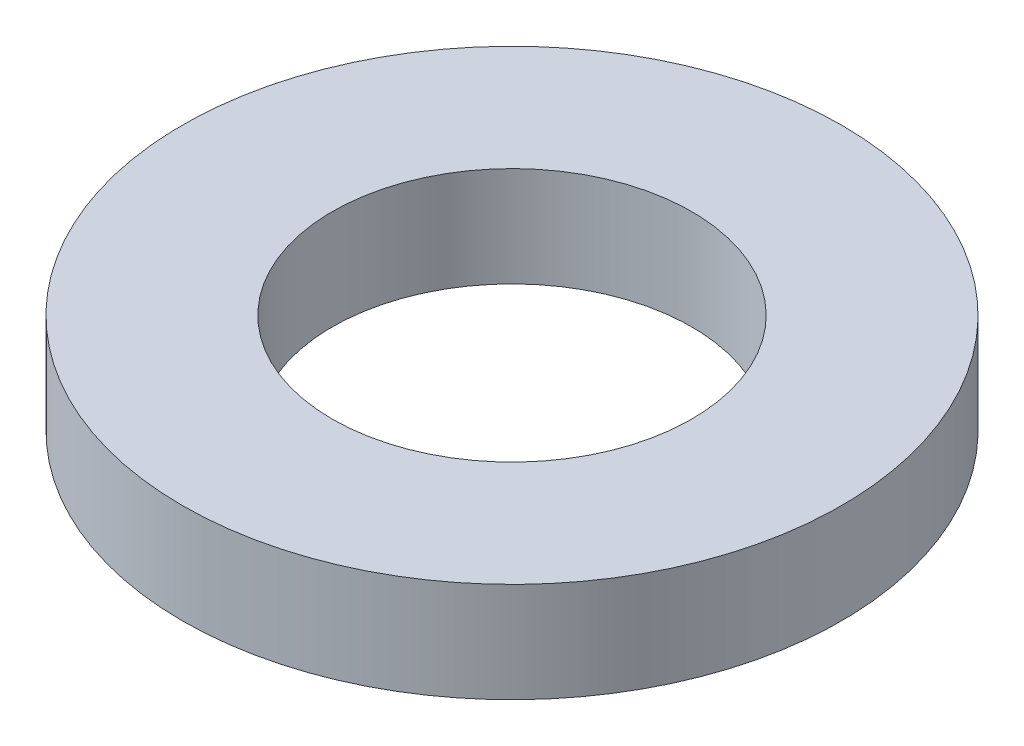
ISO-10303-21;
HEADER;
FILE_DESCRIPTION(('STEP AP214'),'2;1');
FILE_NAME('part.step','',(''),(''),'','','');
FILE_SCHEMA(('AUTOMOTIVE_DESIGN { 1 0 10303 214 1 1 1 1 }'));
ENDSEC;
DATA;
#1=APPLICATION_CONTEXT('core data for automotive mechanical design processes');
#2=APPLICATION_PROTOCOL_DEFINITION('international standard','automotive_design',2000,#1);
#3=PRODUCT_CONTEXT('',#1,'mechanical');
#4=PRODUCT('Part','Part','',(#3));
#5=PRODUCT_RELATED_PRODUCT_CATEGORY('part','',(#4));
#6=PRODUCT_DEFINITION_FORMATION('','',#4);
#7=PRODUCT_DEFINITION_CONTEXT('part definition',#1,'design');
#8=PRODUCT_DEFINITION('design','',#6,#7);
#9=PRODUCT_DEFINITION_SHAPE('','',#8);
#10=(LENGTH_UNIT() NAMED_UNIT(*) SI_UNIT(.MILLI.,.METRE.));
#11=(NAMED_UNIT(*) PLANE_ANGLE_UNIT() SI_UNIT($,.RADIAN.));
#12=(NAMED_UNIT(*) SI_UNIT($,.STERADIAN.) SOLID_ANGLE_UNIT());
#13=UNCERTAINTY_MEASURE_WITH_UNIT(LENGTH_MEASURE(1.E-05),#10,'distance_accuracy_value','');
#14=(GEOMETRIC_REPRESENTATION_CONTEXT(3) GLOBAL_UNCERTAINTY_ASSIGNED_CONTEXT((#13)) GLOBAL_UNIT_ASSIGNED_CONTEXT((#10,
#11,#12)) REPRESENTATION_CONTEXT('',''));
#15=CARTESIAN_POINT('',(0.,0.,0.));
#16=DIRECTION('',(0.,0.,1.));
#17=DIRECTION('',(1.,0.,0.));
#18=AXIS2_PLACEMENT_3D('',#15,#16,#17);
#19=CARTESIAN_POINT('',(0.,1.,0.));
#20=DIRECTION('',(0.,1.,0.));
#21=DIRECTION('',(0.,0.,1.));
#22=AXIS2_PLACEMENT_3D('',#19,#20,#21);
#23=PLANE('',#22);
#24=CARTESIAN_POINT('',(0.,1.,0.));
#25=DIRECTION('',(0.,1.,0.));
#26=DIRECTION('',(0.,0.,1.));
#27=AXIS2_PLACEMENT_3D('',#24,#25,#26);
#28=CIRCLE('',#27,3.3);
#29=CARTESIAN_POINT('',(0.,1.,3.3));
#30=VERTEX_POINT('',#29);
#31=EDGE_CURVE('E10',#30,#30,#28,.T.);
#32=ORIENTED_EDGE('',*,*,#31,.T.);
#33=EDGE_LOOP('',(#32));
#34=FACE_BOUND('',#33,.T.);
#35=CARTESIAN_POINT('',(0.,1.,0.));
#36=DIRECTION('',(0.,1.,0.));
#37=DIRECTION('',(0.,0.,1.));
#38=AXIS2_PLACEMENT_3D('',#35,#36,#37);
#39=CIRCLE('',#38,1.8);
#40=CARTESIAN_POINT('',(0.,1.,1.8));
#41=VERTEX_POINT('',#40);
#42=EDGE_CURVE('E42',#41,#41,#39,.T.);
#43=ORIENTED_EDGE('',*,*,#42,.F.);
#44=EDGE_LOOP('',(#43));
#45=FACE_BOUND('',#44,.T.);
#46=ADVANCED_FACE('F31',(#34,#45),#23,.T.);
#47=CARTESIAN_POINT('',(0.,0.,0.));
#48=DIRECTION('',(0.,1.,0.));
#49=DIRECTION('',(0.,0.,1.));
#50=AXIS2_PLACEMENT_3D('',#47,#48,#49);
#51=PLANE('',#50);
#52=CARTESIAN_POINT('',(0.,0.,0.));
#53=DIRECTION('',(0.,1.,0.));
#54=DIRECTION('',(0.,0.,1.));
#55=AXIS2_PLACEMENT_3D('',#52,#53,#54);
#56=CIRCLE('',#55,3.3);
#57=CARTESIAN_POINT('',(0.,0.,3.3));
#58=VERTEX_POINT('',#57);
#59=EDGE_CURVE('E35',#58,#58,#56,.T.);
#60=ORIENTED_EDGE('',*,*,#59,.F.);
#61=EDGE_LOOP('',(#60));
#62=FACE_BOUND('',#61,.T.);
#63=CARTESIAN_POINT('',(0.,0.,0.));
#64=DIRECTION('',(0.,1.,0.));
#65=DIRECTION('',(0.,0.,1.));
#66=AXIS2_PLACEMENT_3D('',#63,#64,#65);
#67=CIRCLE('',#66,1.8);
#68=CARTESIAN_POINT('',(0.,0.,1.8));
#69=VERTEX_POINT('',#68);
#70=EDGE_CURVE('E44',#69,#69,#67,.T.);
#71=ORIENTED_EDGE('',*,*,#70,.T.);
#72=EDGE_LOOP('',(#71));
#73=FACE_BOUND('',#72,.T.);
#74=ADVANCED_FACE('F54',(#62,#73),#51,.F.);
#75=CARTESIAN_POINT('',(0.,1.,0.));
#76=DIRECTION('',(0.,-1.,0.));
#77=DIRECTION('',(0.,0.,-1.));
#78=AXIS2_PLACEMENT_3D('',#75,#76,#77);
#79=CYLINDRICAL_SURFACE('',#78,3.3);
#80=ORIENTED_EDGE('',*,*,#31,.F.);
#81=EDGE_LOOP('',(#80));
#82=FACE_BOUND('',#81,.T.);
#83=ORIENTED_EDGE('',*,*,#59,.T.);
#84=EDGE_LOOP('',(#83));
#85=FACE_BOUND('',#84,.T.);
#86=ADVANCED_FACE('F33',(#82,#85),#79,.T.);
#87=CARTESIAN_POINT('',(0.,1.,0.));
#88=DIRECTION('',(0.,-1.,0.));
#89=DIRECTION('',(0.,0.,-1.));
#90=AXIS2_PLACEMENT_3D('',#87,#88,#89);
#91=CYLINDRICAL_SURFACE('',#90,1.8);
#92=ORIENTED_EDGE('',*,*,#42,.T.);
#93=EDGE_LOOP('',(#92));
#94=FACE_BOUND('',#93,.T.);
#95=ORIENTED_EDGE('',*,*,#70,.F.);
#96=EDGE_LOOP('',(#95));
#97=FACE_BOUND('',#96,.T.);
#98=ADVANCED_FACE('F50',(#94,#97),#91,.F.);
#99=CLOSED_SHELL('',(#46,#74,#86,#98));
#100=MANIFOLD_SOLID_BREP('B2',#99);
#101=ADVANCED_BREP_SHAPE_REPRESENTATION('',(#18,#100),#14);
#102=SHAPE_DEFINITION_REPRESENTATION(#9,#101);
ENDSEC;
END-ISO-10303-21;
